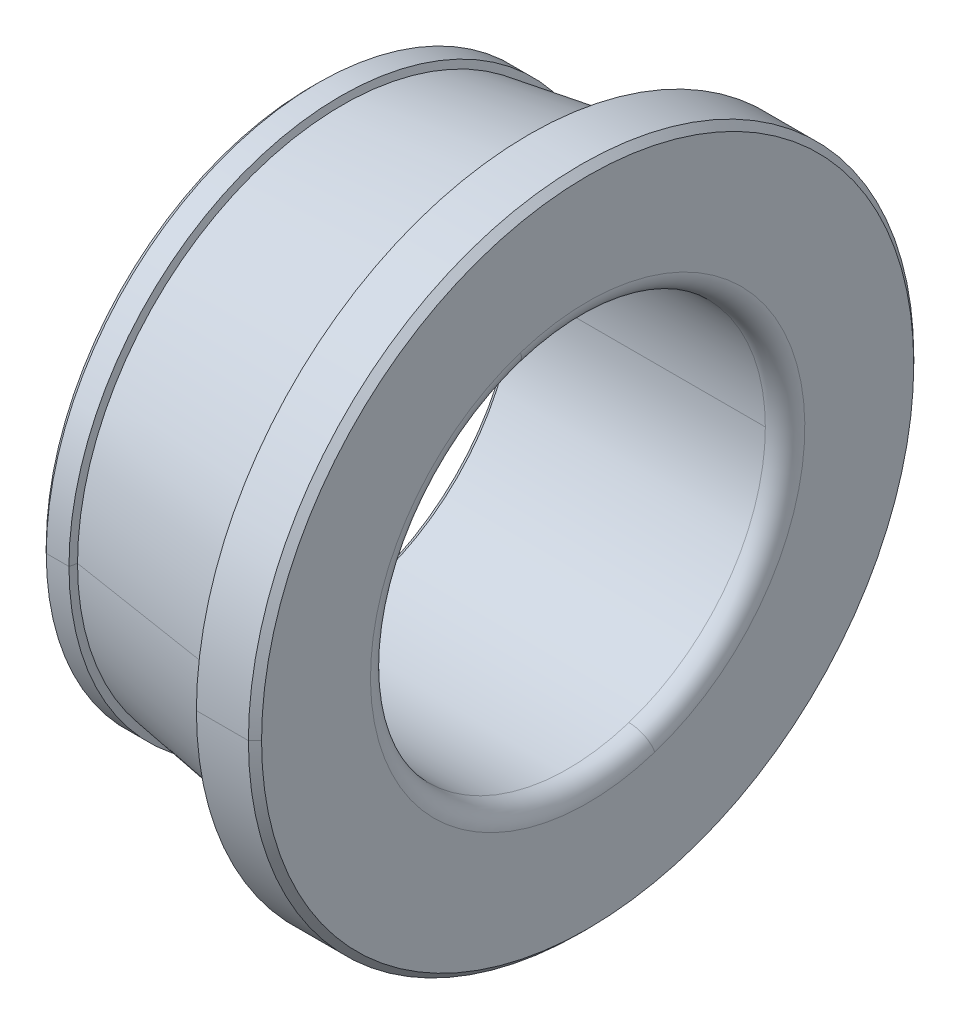
ISO-10303-21;
HEADER;
FILE_DESCRIPTION(('STEP AP214'),'2;1');
FILE_NAME('part.step','',(''),(''),'','','');
FILE_SCHEMA(('AUTOMOTIVE_DESIGN { 1 0 10303 214 1 1 1 1 }'));
ENDSEC;
DATA;
#1=APPLICATION_CONTEXT('core data for automotive mechanical design processes');
#2=APPLICATION_PROTOCOL_DEFINITION('international standard','automotive_design',2000,#1);
#3=PRODUCT_CONTEXT('',#1,'mechanical');
#4=PRODUCT('Part','Part','',(#3));
#5=PRODUCT_RELATED_PRODUCT_CATEGORY('part','',(#4));
#6=PRODUCT_DEFINITION_FORMATION('','',#4);
#7=PRODUCT_DEFINITION_CONTEXT('part definition',#1,'design');
#8=PRODUCT_DEFINITION('design','',#6,#7);
#9=PRODUCT_DEFINITION_SHAPE('','',#8);
#10=(LENGTH_UNIT() NAMED_UNIT(*) SI_UNIT(.MILLI.,.METRE.));
#11=(NAMED_UNIT(*) PLANE_ANGLE_UNIT() SI_UNIT($,.RADIAN.));
#12=(NAMED_UNIT(*) SI_UNIT($,.STERADIAN.) SOLID_ANGLE_UNIT());
#13=UNCERTAINTY_MEASURE_WITH_UNIT(LENGTH_MEASURE(1.E-05),#10,'distance_accuracy_value','');
#14=(GEOMETRIC_REPRESENTATION_CONTEXT(3) GLOBAL_UNCERTAINTY_ASSIGNED_CONTEXT((#13)) GLOBAL_UNIT_ASSIGNED_CONTEXT((#10,
#11,#12)) REPRESENTATION_CONTEXT('',''));
#15=CARTESIAN_POINT('',(0.,0.,0.));
#16=DIRECTION('',(0.,0.,1.));
#17=DIRECTION('',(1.,0.,0.));
#18=AXIS2_PLACEMENT_3D('',#15,#16,#17);
#19=CARTESIAN_POINT('',(1.25,13.422166666667,0.));
#20=DIRECTION('',(-1.,0.,0.));
#21=DIRECTION('',(0.,0.,1.));
#22=AXIS2_PLACEMENT_3D('',#19,#20,#21);
#23=PLANE('',#22);
#24=CARTESIAN_POINT('',(1.25,0.,0.));
#25=DIRECTION('',(1.,0.,0.));
#26=DIRECTION('',(0.,0.,-1.));
#27=AXIS2_PLACEMENT_3D('',#24,#25,#26);
#28=CIRCLE('',#27,10.333333333333);
#29=CARTESIAN_POINT('',(1.25,0.,-10.333333333333));
#30=VERTEX_POINT('',#29);
#31=CARTESIAN_POINT('',(1.25,0.,10.333333333333));
#32=VERTEX_POINT('',#31);
#33=EDGE_CURVE('E11',#30,#32,#28,.T.);
#34=ORIENTED_EDGE('',*,*,#33,.T.);
#35=CARTESIAN_POINT('',(1.25,0.,0.));
#36=DIRECTION('',(1.,0.,0.));
#37=DIRECTION('',(0.,0.,-1.));
#38=AXIS2_PLACEMENT_3D('',#35,#36,#37);
#39=CIRCLE('',#38,10.333333333333);
#40=EDGE_CURVE('E25',#32,#30,#39,.T.);
#41=ORIENTED_EDGE('',*,*,#40,.T.);
#42=EDGE_LOOP('',(#34,#41));
#43=FACE_BOUND('',#42,.T.);
#44=CARTESIAN_POINT('',(1.25,0.,0.));
#45=DIRECTION('',(1.,0.,0.));
#46=DIRECTION('',(0.,0.,-1.));
#47=AXIS2_PLACEMENT_3D('',#44,#45,#46);
#48=CIRCLE('',#47,13.422166666667);
#49=CARTESIAN_POINT('',(1.25,0.,13.422166666667));
#50=VERTEX_POINT('',#49);
#51=CARTESIAN_POINT('',(1.25,0.,-13.422166666667));
#52=VERTEX_POINT('',#51);
#53=EDGE_CURVE('E371',#50,#52,#48,.T.);
#54=ORIENTED_EDGE('',*,*,#53,.F.);
#55=CARTESIAN_POINT('',(1.25,0.,0.));
#56=DIRECTION('',(1.,0.,0.));
#57=DIRECTION('',(0.,0.,-1.));
#58=AXIS2_PLACEMENT_3D('',#55,#56,#57);
#59=CIRCLE('',#58,13.422166666667);
#60=EDGE_CURVE('E366',#52,#50,#59,.T.);
#61=ORIENTED_EDGE('',*,*,#60,.F.);
#62=EDGE_LOOP('',(#54,#61));
#63=FACE_BOUND('',#62,.T.);
#64=ADVANCED_FACE('F17',(#43,#63),#23,.T.);
#65=CARTESIAN_POINT('',(1.5833333333333,0.,0.));
#66=DIRECTION('',(1.,0.,0.));
#67=DIRECTION('',(0.,-1.,0.));
#68=AXIS2_PLACEMENT_3D('',#65,#66,#67);
#69=CONICAL_SURFACE('',#68,13.7555,0.785398163396998);
#70=DIRECTION('',(0.707106781186866,0.,0.707106781186229));
#71=VECTOR('',#70,1.);
#72=CARTESIAN_POINT('',(1.25,0.,13.422166666667));
#73=LINE('',#72,#71);
#74=CARTESIAN_POINT('',(1.5833333333333,0.,13.7555));
#75=VERTEX_POINT('',#74);
#76=EDGE_CURVE('E362',#50,#75,#73,.T.);
#77=ORIENTED_EDGE('',*,*,#76,.T.);
#78=CARTESIAN_POINT('',(1.5833333333333,0.,0.));
#79=DIRECTION('',(1.,0.,0.));
#80=DIRECTION('',(0.,0.,-1.));
#81=AXIS2_PLACEMENT_3D('',#78,#79,#80);
#82=CIRCLE('',#81,13.7555);
#83=CARTESIAN_POINT('',(1.5833333333333,0.,-13.7555));
#84=VERTEX_POINT('',#83);
#85=EDGE_CURVE('E357',#84,#75,#82,.T.);
#86=ORIENTED_EDGE('',*,*,#85,.F.);
#87=DIRECTION('',(0.707106781186866,0.,-0.707106781186229));
#88=VECTOR('',#87,1.);
#89=CARTESIAN_POINT('',(1.25,0.,-13.422166666667));
#90=LINE('',#89,#88);
#91=EDGE_CURVE('E352',#52,#84,#90,.T.);
#92=ORIENTED_EDGE('',*,*,#91,.F.);
#93=ORIENTED_EDGE('',*,*,#60,.T.);
#94=EDGE_LOOP('',(#77,#86,#92,#93));
#95=FACE_BOUND('',#94,.T.);
#96=ADVANCED_FACE('F387',(#95),#69,.T.);
#97=CARTESIAN_POINT('',(1.5833333333333,0.,0.));
#98=DIRECTION('',(1.,0.,0.));
#99=DIRECTION('',(0.,1.,0.));
#100=AXIS2_PLACEMENT_3D('',#97,#98,#99);
#101=CONICAL_SURFACE('',#100,13.7555,0.785398163396998);
#102=ORIENTED_EDGE('',*,*,#76,.F.);
#103=ORIENTED_EDGE('',*,*,#53,.T.);
#104=ORIENTED_EDGE('',*,*,#91,.T.);
#105=CARTESIAN_POINT('',(1.5833333333333,0.,0.));
#106=DIRECTION('',(1.,0.,0.));
#107=DIRECTION('',(0.,0.,-1.));
#108=AXIS2_PLACEMENT_3D('',#105,#106,#107);
#109=CIRCLE('',#108,13.7555);
#110=EDGE_CURVE('E347',#75,#84,#109,.T.);
#111=ORIENTED_EDGE('',*,*,#110,.F.);
#112=EDGE_LOOP('',(#102,#103,#104,#111));
#113=FACE_BOUND('',#112,.T.);
#114=ADVANCED_FACE('F382',(#113),#101,.T.);
#115=CARTESIAN_POINT('',(15.25,0.,0.));
#116=DIRECTION('',(1.,0.,0.));
#117=DIRECTION('',(0.,1.,0.));
#118=AXIS2_PLACEMENT_3D('',#115,#116,#117);
#119=CYLINDRICAL_SURFACE('',#118,13.7555);
#120=DIRECTION('',(1.,0.,0.));
#121=VECTOR('',#120,1.);
#122=CARTESIAN_POINT('',(1.5833333333333,0.,13.7555));
#123=LINE('',#122,#121);
#124=CARTESIAN_POINT('',(2.7336148439793,0.,13.7555));
#125=VERTEX_POINT('',#124);
#126=EDGE_CURVE('E342',#75,#125,#123,.T.);
#127=ORIENTED_EDGE('',*,*,#126,.F.);
#128=ORIENTED_EDGE('',*,*,#110,.T.);
#129=DIRECTION('',(1.,0.,0.));
#130=VECTOR('',#129,1.);
#131=CARTESIAN_POINT('',(1.5833333333333,0.,-13.7555));
#132=LINE('',#131,#130);
#133=CARTESIAN_POINT('',(2.7336148439793,0.,-13.7555));
#134=VERTEX_POINT('',#133);
#135=EDGE_CURVE('E338',#84,#134,#132,.T.);
#136=ORIENTED_EDGE('',*,*,#135,.T.);
#137=CARTESIAN_POINT('',(2.7336148439793,0.,0.));
#138=DIRECTION('',(1.,0.,0.));
#139=DIRECTION('',(0.,0.,-1.));
#140=AXIS2_PLACEMENT_3D('',#137,#138,#139);
#141=CIRCLE('',#140,13.7555);
#142=EDGE_CURVE('E333',#125,#134,#141,.T.);
#143=ORIENTED_EDGE('',*,*,#142,.F.);
#144=EDGE_LOOP('',(#127,#128,#136,#143));
#145=FACE_BOUND('',#144,.T.);
#146=ADVANCED_FACE('F394',(#145),#119,.T.);
#147=CARTESIAN_POINT('',(2.8147202541345,0.,0.));
#148=DIRECTION('',(-1.,0.,0.));
#149=DIRECTION('',(0.,1.,0.));
#150=AXIS2_PLACEMENT_3D('',#147,#148,#149);
#151=CONICAL_SURFACE('',#150,13.402874416571,1.34472382878367);
#152=DIRECTION('',(-0.224151698358248,0.,-0.974554265355764));
#153=VECTOR('',#152,1.);
#154=CARTESIAN_POINT('',(2.8147202541345,0.,-13.402874416571));
#155=LINE('',#154,#153);
#156=CARTESIAN_POINT('',(2.8147202541345,0.,-13.402874416571));
#157=VERTEX_POINT('',#156);
#158=EDGE_CURVE('E328',#157,#134,#155,.T.);
#159=ORIENTED_EDGE('',*,*,#158,.F.);
#160=CARTESIAN_POINT('',(2.8147202541345,0.,0.));
#161=DIRECTION('',(1.,0.,0.));
#162=DIRECTION('',(0.,0.,-1.));
#163=AXIS2_PLACEMENT_3D('',#160,#161,#162);
#164=CIRCLE('',#163,13.402874416571);
#165=CARTESIAN_POINT('',(2.8147202541345,0.,13.402874416571));
#166=VERTEX_POINT('',#165);
#167=EDGE_CURVE('E323',#166,#157,#164,.T.);
#168=ORIENTED_EDGE('',*,*,#167,.F.);
#169=DIRECTION('',(-0.224151698358248,0.,0.974554265355764));
#170=VECTOR('',#169,1.);
#171=CARTESIAN_POINT('',(2.8147202541345,0.,13.402874416571));
#172=LINE('',#171,#170);
#173=EDGE_CURVE('E318',#166,#125,#172,.T.);
#174=ORIENTED_EDGE('',*,*,#173,.T.);
#175=ORIENTED_EDGE('',*,*,#142,.T.);
#176=EDGE_LOOP('',(#159,#168,#174,#175));
#177=FACE_BOUND('',#176,.T.);
#178=ADVANCED_FACE('F396',(#177),#151,.T.);
#179=CARTESIAN_POINT('',(2.8147202541345,0.,0.));
#180=DIRECTION('',(-1.,0.,0.));
#181=DIRECTION('',(0.,-1.,0.));
#182=AXIS2_PLACEMENT_3D('',#179,#180,#181);
#183=CONICAL_SURFACE('',#182,13.402874416571,1.34472382878367);
#184=ORIENTED_EDGE('',*,*,#158,.T.);
#185=CARTESIAN_POINT('',(2.7336148439793,0.,0.));
#186=DIRECTION('',(1.,0.,0.));
#187=DIRECTION('',(0.,0.,-1.));
#188=AXIS2_PLACEMENT_3D('',#185,#186,#187);
#189=CIRCLE('',#188,13.7555);
#190=EDGE_CURVE('E313',#134,#125,#189,.T.);
#191=ORIENTED_EDGE('',*,*,#190,.T.);
#192=ORIENTED_EDGE('',*,*,#173,.F.);
#193=CARTESIAN_POINT('',(2.8147202541345,0.,0.));
#194=DIRECTION('',(1.,0.,0.));
#195=DIRECTION('',(0.,0.,-1.));
#196=AXIS2_PLACEMENT_3D('',#193,#194,#195);
#197=CIRCLE('',#196,13.402874416571);
#198=EDGE_CURVE('E308',#157,#166,#197,.T.);
#199=ORIENTED_EDGE('',*,*,#198,.F.);
#200=EDGE_LOOP('',(#184,#191,#192,#199));
#201=FACE_BOUND('',#200,.T.);
#202=ADVANCED_FACE('F401',(#201),#183,.T.);
#203=CARTESIAN_POINT('',(12.717476808964,0.,0.));
#204=DIRECTION('',(1.,0.,0.));
#205=DIRECTION('',(0.,-1.,0.));
#206=AXIS2_PLACEMENT_3D('',#203,#204,#205);
#207=CONICAL_SURFACE('',#206,14.960865559481,0.15604988842076);
#208=DIRECTION('',(0.987848904399816,0.,0.155417315882381));
#209=VECTOR('',#208,1.);
#210=CARTESIAN_POINT('',(2.81472025413452,0.,13.402874416571));
#211=LINE('',#210,#209);
#212=CARTESIAN_POINT('',(12.717476808964,0.,14.960865559481));
#213=VERTEX_POINT('',#212);
#214=EDGE_CURVE('E304',#166,#213,#211,.T.);
#215=ORIENTED_EDGE('',*,*,#214,.T.);
#216=CARTESIAN_POINT('',(12.717476808964,0.,0.));
#217=DIRECTION('',(1.,0.,0.));
#218=DIRECTION('',(0.,0.,-1.));
#219=AXIS2_PLACEMENT_3D('',#216,#217,#218);
#220=CIRCLE('',#219,14.960865559481);
#221=CARTESIAN_POINT('',(12.717476808964,0.,-14.960865559481));
#222=VERTEX_POINT('',#221);
#223=EDGE_CURVE('E299',#222,#213,#220,.T.);
#224=ORIENTED_EDGE('',*,*,#223,.F.);
#225=DIRECTION('',(0.987848904399816,0.,-0.155417315882381));
#226=VECTOR('',#225,1.);
#227=CARTESIAN_POINT('',(2.81472025413452,0.,-13.402874416571));
#228=LINE('',#227,#226);
#229=EDGE_CURVE('E294',#157,#222,#228,.T.);
#230=ORIENTED_EDGE('',*,*,#229,.F.);
#231=ORIENTED_EDGE('',*,*,#198,.T.);
#232=EDGE_LOOP('',(#215,#224,#230,#231));
#233=FACE_BOUND('',#232,.T.);
#234=ADVANCED_FACE('F408',(#233),#207,.T.);
#235=CARTESIAN_POINT('',(12.717476808964,0.,0.));
#236=DIRECTION('',(1.,0.,0.));
#237=DIRECTION('',(0.,1.,0.));
#238=AXIS2_PLACEMENT_3D('',#235,#236,#237);
#239=CONICAL_SURFACE('',#238,14.960865559481,0.15604988842076);
#240=ORIENTED_EDGE('',*,*,#214,.F.);
#241=ORIENTED_EDGE('',*,*,#167,.T.);
#242=ORIENTED_EDGE('',*,*,#229,.T.);
#243=CARTESIAN_POINT('',(12.717476808964,0.,0.));
#244=DIRECTION('',(1.,0.,0.));
#245=DIRECTION('',(0.,0.,-1.));
#246=AXIS2_PLACEMENT_3D('',#243,#244,#245);
#247=CIRCLE('',#246,14.960865559481);
#248=EDGE_CURVE('E289',#213,#222,#247,.T.);
#249=ORIENTED_EDGE('',*,*,#248,.F.);
#250=EDGE_LOOP('',(#240,#241,#242,#249));
#251=FACE_BOUND('',#250,.T.);
#252=ADVANCED_FACE('F405',(#251),#239,.T.);
#253=CARTESIAN_POINT('',(12.282967712527,0.,0.));
#254=DIRECTION('',(-1.,0.,0.));
#255=DIRECTION('',(0.,1.,0.));
#256=AXIS2_PLACEMENT_3D('',#253,#254,#255);
#257=CONICAL_SURFACE('',#256,16.85,1.34472382878411);
#258=DIRECTION('',(-0.224151698357829,0.,-0.97455426535586));
#259=VECTOR('',#258,1.);
#260=CARTESIAN_POINT('',(12.717476808964,0.,-14.960865559481));
#261=LINE('',#260,#259);
#262=CARTESIAN_POINT('',(12.282967712527,0.,-16.85));
#263=VERTEX_POINT('',#262);
#264=EDGE_CURVE('E285',#222,#263,#261,.T.);
#265=ORIENTED_EDGE('',*,*,#264,.T.);
#266=CARTESIAN_POINT('',(12.282967712527,0.,0.));
#267=DIRECTION('',(1.,0.,0.));
#268=DIRECTION('',(0.,0.,-1.));
#269=AXIS2_PLACEMENT_3D('',#266,#267,#268);
#270=CIRCLE('',#269,16.85);
#271=CARTESIAN_POINT('',(12.282967712527,0.,16.85));
#272=VERTEX_POINT('',#271);
#273=EDGE_CURVE('E280',#272,#263,#270,.T.);
#274=ORIENTED_EDGE('',*,*,#273,.F.);
#275=DIRECTION('',(-0.224151698357829,0.,0.97455426535586));
#276=VECTOR('',#275,1.);
#277=CARTESIAN_POINT('',(12.717476808964,0.,14.960865559481));
#278=LINE('',#277,#276);
#279=EDGE_CURVE('E275',#213,#272,#278,.T.);
#280=ORIENTED_EDGE('',*,*,#279,.F.);
#281=ORIENTED_EDGE('',*,*,#248,.T.);
#282=EDGE_LOOP('',(#265,#274,#280,#281));
#283=FACE_BOUND('',#282,.T.);
#284=ADVANCED_FACE('F410',(#283),#257,.F.);
#285=CARTESIAN_POINT('',(12.282967712527,0.,0.));
#286=DIRECTION('',(-1.,0.,0.));
#287=DIRECTION('',(0.,-1.,0.));
#288=AXIS2_PLACEMENT_3D('',#285,#286,#287);
#289=CONICAL_SURFACE('',#288,16.85,1.34472382878411);
#290=ORIENTED_EDGE('',*,*,#264,.F.);
#291=ORIENTED_EDGE('',*,*,#223,.T.);
#292=ORIENTED_EDGE('',*,*,#279,.T.);
#293=CARTESIAN_POINT('',(12.282967712527,0.,0.));
#294=DIRECTION('',(1.,0.,0.));
#295=DIRECTION('',(0.,0.,-1.));
#296=AXIS2_PLACEMENT_3D('',#293,#294,#295);
#297=CIRCLE('',#296,16.85);
#298=EDGE_CURVE('E270',#263,#272,#297,.T.);
#299=ORIENTED_EDGE('',*,*,#298,.F.);
#300=EDGE_LOOP('',(#290,#291,#292,#299));
#301=FACE_BOUND('',#300,.T.);
#302=ADVANCED_FACE('F415',(#301),#289,.F.);
#303=CARTESIAN_POINT('',(15.25,0.,0.));
#304=DIRECTION('',(1.,0.,0.));
#305=DIRECTION('',(0.,-1.,0.));
#306=AXIS2_PLACEMENT_3D('',#303,#304,#305);
#307=CYLINDRICAL_SURFACE('',#306,16.85);
#308=DIRECTION('',(1.,0.,0.));
#309=VECTOR('',#308,1.);
#310=CARTESIAN_POINT('',(12.282967712527,0.,16.85));
#311=LINE('',#310,#309);
#312=CARTESIAN_POINT('',(14.916666666667,0.,16.85));
#313=VERTEX_POINT('',#312);
#314=EDGE_CURVE('E266',#272,#313,#311,.T.);
#315=ORIENTED_EDGE('',*,*,#314,.T.);
#316=CARTESIAN_POINT('',(14.916666666667,0.,0.));
#317=DIRECTION('',(1.,0.,0.));
#318=DIRECTION('',(0.,0.,-1.));
#319=AXIS2_PLACEMENT_3D('',#316,#317,#318);
#320=CIRCLE('',#319,16.85);
#321=CARTESIAN_POINT('',(14.916666666667,0.,-16.85));
#322=VERTEX_POINT('',#321);
#323=EDGE_CURVE('E261',#322,#313,#320,.T.);
#324=ORIENTED_EDGE('',*,*,#323,.F.);
#325=DIRECTION('',(1.,0.,0.));
#326=VECTOR('',#325,1.);
#327=CARTESIAN_POINT('',(12.282967712527,0.,-16.85));
#328=LINE('',#327,#326);
#329=EDGE_CURVE('E256',#263,#322,#328,.T.);
#330=ORIENTED_EDGE('',*,*,#329,.F.);
#331=ORIENTED_EDGE('',*,*,#298,.T.);
#332=EDGE_LOOP('',(#315,#324,#330,#331));
#333=FACE_BOUND('',#332,.T.);
#334=ADVANCED_FACE('F421',(#333),#307,.T.);
#335=CARTESIAN_POINT('',(15.25,0.,0.));
#336=DIRECTION('',(1.,0.,0.));
#337=DIRECTION('',(0.,1.,0.));
#338=AXIS2_PLACEMENT_3D('',#335,#336,#337);
#339=CYLINDRICAL_SURFACE('',#338,16.85);
#340=ORIENTED_EDGE('',*,*,#314,.F.);
#341=ORIENTED_EDGE('',*,*,#273,.T.);
#342=ORIENTED_EDGE('',*,*,#329,.T.);
#343=CARTESIAN_POINT('',(14.916666666667,0.,0.));
#344=DIRECTION('',(1.,0.,0.));
#345=DIRECTION('',(0.,0.,-1.));
#346=AXIS2_PLACEMENT_3D('',#343,#344,#345);
#347=CIRCLE('',#346,16.85);
#348=EDGE_CURVE('E251',#313,#322,#347,.T.);
#349=ORIENTED_EDGE('',*,*,#348,.F.);
#350=EDGE_LOOP('',(#340,#341,#342,#349));
#351=FACE_BOUND('',#350,.T.);
#352=ADVANCED_FACE('F419',(#351),#339,.T.);
#353=CARTESIAN_POINT('',(15.25,0.,0.));
#354=DIRECTION('',(-1.,0.,0.));
#355=DIRECTION('',(0.,1.,0.));
#356=AXIS2_PLACEMENT_3D('',#353,#354,#355);
#357=CONICAL_SURFACE('',#356,16.516666666667,0.78539816339745);
#358=DIRECTION('',(-0.707106781186548,0.,-0.707106781186548));
#359=VECTOR('',#358,1.);
#360=CARTESIAN_POINT('',(15.25,0.,-16.516666666667));
#361=LINE('',#360,#359);
#362=CARTESIAN_POINT('',(15.25,0.,-16.516666666667));
#363=VERTEX_POINT('',#362);
#364=EDGE_CURVE('E246',#363,#322,#361,.T.);
#365=ORIENTED_EDGE('',*,*,#364,.F.);
#366=CARTESIAN_POINT('',(15.25,0.,0.));
#367=DIRECTION('',(1.,0.,0.));
#368=DIRECTION('',(0.,0.,-1.));
#369=AXIS2_PLACEMENT_3D('',#366,#367,#368);
#370=CIRCLE('',#369,16.516666666667);
#371=CARTESIAN_POINT('',(15.25,0.,16.516666666667));
#372=VERTEX_POINT('',#371);
#373=EDGE_CURVE('E241',#372,#363,#370,.T.);
#374=ORIENTED_EDGE('',*,*,#373,.F.);
#375=DIRECTION('',(-0.707106781186548,0.,0.707106781186548));
#376=VECTOR('',#375,1.);
#377=CARTESIAN_POINT('',(15.25,0.,16.516666666667));
#378=LINE('',#377,#376);
#379=EDGE_CURVE('E236',#372,#313,#378,.T.);
#380=ORIENTED_EDGE('',*,*,#379,.T.);
#381=ORIENTED_EDGE('',*,*,#348,.T.);
#382=EDGE_LOOP('',(#365,#374,#380,#381));
#383=FACE_BOUND('',#382,.T.);
#384=ADVANCED_FACE('F427',(#383),#357,.T.);
#385=CARTESIAN_POINT('',(15.25,0.,0.));
#386=DIRECTION('',(-1.,0.,0.));
#387=DIRECTION('',(0.,-1.,0.));
#388=AXIS2_PLACEMENT_3D('',#385,#386,#387);
#389=CONICAL_SURFACE('',#388,16.516666666667,0.78539816339745);
#390=ORIENTED_EDGE('',*,*,#364,.T.);
#391=ORIENTED_EDGE('',*,*,#323,.T.);
#392=ORIENTED_EDGE('',*,*,#379,.F.);
#393=CARTESIAN_POINT('',(15.25,0.,0.));
#394=DIRECTION('',(1.,0.,0.));
#395=DIRECTION('',(0.,0.,-1.));
#396=AXIS2_PLACEMENT_3D('',#393,#394,#395);
#397=CIRCLE('',#396,16.516666666667);
#398=EDGE_CURVE('E233',#363,#372,#397,.T.);
#399=ORIENTED_EDGE('',*,*,#398,.F.);
#400=EDGE_LOOP('',(#390,#391,#392,#399));
#401=FACE_BOUND('',#400,.T.);
#402=ADVANCED_FACE('F424',(#401),#389,.T.);
#403=CARTESIAN_POINT('',(15.25,11.,0.));
#404=DIRECTION('',(1.,0.,0.));
#405=DIRECTION('',(0.,0.,-1.));
#406=AXIS2_PLACEMENT_3D('',#403,#404,#405);
#407=PLANE('',#406);
#408=ORIENTED_EDGE('',*,*,#398,.T.);
#409=ORIENTED_EDGE('',*,*,#373,.T.);
#410=EDGE_LOOP('',(#408,#409));
#411=FACE_BOUND('',#410,.T.);
#412=CARTESIAN_POINT('',(15.25,-10.4616216792452,-3.39918693812396));
#413=CARTESIAN_POINT('',(15.25,-10.4060061879769,-3.57036617524389));
#414=CARTESIAN_POINT('',(15.25,-10.3461823267673,-3.74017768848981));
#415=CARTESIAN_POINT('',(15.25,-10.2182776734522,-4.07666213967826));
#416=CARTESIAN_POINT('',(15.25,-10.1501968813469,-4.24333507762079));
#417=CARTESIAN_POINT('',(15.25,-10.0059381752273,-4.57313925064709));
#418=CARTESIAN_POINT('',(15.25,-9.92976026121305,-4.73627048573086));
#419=CARTESIAN_POINT('',(15.25,-9.76949195689547,-5.05859868374808));
#420=CARTESIAN_POINT('',(15.25,-9.68540156659211,-5.21779564668152));
#421=CARTESIAN_POINT('',(15.25,-9.50951058900669,-5.53187166624998));
#422=CARTESIAN_POINT('',(15.25,-9.41771000172464,-5.68675072288499));
#423=CARTESIAN_POINT('',(15.25,-9.22661986670586,-5.99181784338258));
#424=CARTESIAN_POINT('',(15.25,-9.12733031896913,-6.14200590724515));
#425=CARTESIAN_POINT('',(15.25,-8.92150143858959,-6.43732921776055));
#426=CARTESIAN_POINT('',(15.25,-8.81496210594678,-6.58246446441337));
#427=CARTESIAN_POINT('',(15.25,-8.59489032414526,-6.8673324991947));
#428=CARTESIAN_POINT('',(15.25,-8.48135787498654,-7.00706528732321));
#429=CARTESIAN_POINT('',(15.25,-8.24757336821175,-7.28079177593882));
#430=CARTESIAN_POINT('',(15.25,-8.12732131059568,-7.41478547642591));
#431=CARTESIAN_POINT('',(15.25,-7.88038728506268,-7.6767109873562));
#432=CARTESIAN_POINT('',(15.25,-7.75370531714575,-7.8046427977994));
#433=CARTESIAN_POINT('',(15.25,-7.49421665885607,-8.05413632966257));
#434=CARTESIAN_POINT('',(15.25,-7.36140996848332,-8.17569805108256));
#435=CARTESIAN_POINT('',(15.25,-7.08999180826153,-8.41215855207623));
#436=CARTESIAN_POINT('',(15.25,-6.95138033841249,-8.52705733164992));
#437=CARTESIAN_POINT('',(15.25,-6.66868654640191,-8.74991514772403));
#438=CARTESIAN_POINT('',(15.25,-6.52460422424036,-8.85787418422444));
#439=CARTESIAN_POINT('',(15.25,-6.23131583454112,-9.06659243137779));
#440=CARTESIAN_POINT('',(15.25,-6.08210976700342,-9.16735164203072));
#441=CARTESIAN_POINT('',(15.25,-5.7789333370369,-9.36142749972496));
#442=CARTESIAN_POINT('',(15.25,-5.62496297460807,-9.45474414676626));
#443=CARTESIAN_POINT('',(15.25,-5.31262888294876,-9.633710069261));
#444=CARTESIAN_POINT('',(15.25,-5.15426515371827,-9.71935934471444));
#445=CARTESIAN_POINT('',(15.25,-4.83352584055033,-9.88278418742687));
#446=CARTESIAN_POINT('',(15.25,-4.67115025661287,-9.96055975468587));
#447=CARTESIAN_POINT('',(15.25,-4.34277841103513,-10.1080498128556));
#448=CARTESIAN_POINT('',(15.25,-4.17678214939485,-10.1777643037663));
#449=CARTESIAN_POINT('',(15.25,-3.8415688479453,-10.3089642609245));
#450=CARTESIAN_POINT('',(15.25,-3.67235180813603,-10.370449727172));
#451=CARTESIAN_POINT('',(15.25,-3.33110460901907,-10.4850435111302));
#452=CARTESIAN_POINT('',(15.25,-3.15907444971138,-10.5381518288409));
#453=CARTESIAN_POINT('',(15.25,-2.81261544731941,-10.6358633731363));
#454=CARTESIAN_POINT('',(15.25,-2.63818660423513,-10.680466599721));
#455=CARTESIAN_POINT('',(15.25,-2.28735044865114,-10.7610605086849));
#456=CARTESIAN_POINT('',(15.25,-2.11094313615143,-10.797051191064));
#457=CARTESIAN_POINT('',(15.25,-1.75657502240383,-10.8603333069105));
#458=CARTESIAN_POINT('',(15.25,-1.57861422115595,-10.8876247403778));
#459=CARTESIAN_POINT('',(15.25,-1.22156785306975,-10.9334426109469));
#460=CARTESIAN_POINT('',(15.25,-1.04248228623143,-10.9519690480487));
#461=CARTESIAN_POINT('',(15.25,-0.683617819780917,-10.980212294077));
#462=CARTESIAN_POINT('',(15.25,-0.503838920168718,-10.9899291030036));
#463=CARTESIAN_POINT('',(15.25,-0.144020891286382,-11.0005296840377));
#464=CARTESIAN_POINT('',(15.25,0.0360182379837549,-11.0014134561453));
#465=CARTESIAN_POINT('',(15.25,0.395922996149997,-10.994345834457));
#466=CARTESIAN_POINT('',(15.25,0.575788625046102,-10.9863944406611));
#467=CARTESIAN_POINT('',(15.25,0.934913070409896,-10.9616756427701));
#468=CARTESIAN_POINT('',(15.25,1.11417188687758,-10.9449082386749));
#469=CARTESIAN_POINT('',(15.25,1.47165085719446,-10.9025978143304));
#470=CARTESIAN_POINT('',(15.25,1.64987101104365,-10.877054794081));
#471=CARTESIAN_POINT('',(15.25,2.00484330816265,-10.8172546728011));
#472=CARTESIAN_POINT('',(15.25,2.18159545143248,-10.7829975717706));
#473=CARTESIAN_POINT('',(15.25,2.53320591599795,-10.7058518172855));
#474=CARTESIAN_POINT('',(15.25,2.70806423729361,-10.6629631638309));
#475=CARTESIAN_POINT('',(15.25,3.05546580889898,-10.5686576270202));
#476=CARTESIAN_POINT('',(15.25,3.22800905920869,-10.5172407436641));
#477=CARTESIAN_POINT('',(15.25,3.57036481703917,-10.4060026148263));
#478=CARTESIAN_POINT('',(15.25,3.74017732455993,-10.3461813693444));
#479=CARTESIAN_POINT('',(15.25,4.07666250360809,-10.2182786308751));
#480=CARTESIAN_POINT('',(15.25,4.24333517513547,-10.1501971378875));
#481=CARTESIAN_POINT('',(15.25,4.57313915313235,-10.0059379186866));
#482=CARTESIAN_POINT('',(15.25,4.73627045960185,-9.9297601924732));
#483=CARTESIAN_POINT('',(15.25,5.05859870987704,-9.76949202563535));
#484=CARTESIAN_POINT('',(15.25,5.21779565368274,-9.68540158501091));
#485=CARTESIAN_POINT('',(15.25,5.53187165924871,-9.50951057058791));
#486=CARTESIAN_POINT('',(15.25,5.68675072100899,-9.41770999678935));
#487=CARTESIAN_POINT('',(15.25,5.99181784525853,-9.22661987164117));
#488=CARTESIAN_POINT('',(15.25,6.1420059077478,-9.12733032029156));
#489=CARTESIAN_POINT('',(15.25,6.43732921725786,-8.9215014372672));
#490=CARTESIAN_POINT('',(15.25,6.58246446427866,-8.81496210559246));
#491=CARTESIAN_POINT('',(15.25,6.86733249932937,-8.59489032449961));
#492=CARTESIAN_POINT('',(15.25,7.00706528735928,-8.4813578750815));
#493=CARTESIAN_POINT('',(15.25,7.28079177590271,-8.24757336811683));
#494=CARTESIAN_POINT('',(15.25,7.41478547641622,-8.12732131057026));
#495=CARTESIAN_POINT('',(15.25,7.67671098736585,-7.88038728508814));
#496=CARTESIAN_POINT('',(15.25,7.80464279780197,-7.75370531715259));
#497=CARTESIAN_POINT('',(15.25,8.05413632965996,-7.49421665884927));
#498=CARTESIAN_POINT('',(15.25,8.17569805108184,-7.36140996848151));
#499=CARTESIAN_POINT('',(15.25,8.4121585520769,-7.08999180826338));
#500=CARTESIAN_POINT('',(15.25,8.52705733165009,-6.95138033841301));
#501=CARTESIAN_POINT('',(15.25,8.74991514772382,-6.66868654640145));
#502=CARTESIAN_POINT('',(15.25,8.85787418422437,-6.52460422424026));
#503=CARTESIAN_POINT('',(15.25,9.06659243137782,-6.23131583454128));
#504=CARTESIAN_POINT('',(15.25,9.16735164203072,-6.08210976700348));
#505=CARTESIAN_POINT('',(15.25,9.36142749972493,-5.77893333703689));
#506=CARTESIAN_POINT('',(15.25,9.45474414676624,-5.6249629746081));
#507=CARTESIAN_POINT('',(15.25,9.63371006926099,-5.3126288829488));
#508=CARTESIAN_POINT('',(15.25,9.71935934471443,-5.15426515371831));
#509=CARTESIAN_POINT('',(15.25,9.88278418742686,-4.83352584055036));
#510=CARTESIAN_POINT('',(15.25,9.96055975468585,-4.6711502566129));
#511=CARTESIAN_POINT('',(15.25,10.1080498128556,-4.34277841103516));
#512=CARTESIAN_POINT('',(15.25,10.1777643037663,-4.17678214939487));
#513=CARTESIAN_POINT('',(15.25,10.3089642609245,-3.84156884794534));
#514=CARTESIAN_POINT('',(15.25,10.3704497271719,-3.67235180813609));
#515=CARTESIAN_POINT('',(15.25,10.4850435111304,-3.33110460901906));
#516=CARTESIAN_POINT('',(15.25,10.5381518288414,-3.15907444971127));
#517=CARTESIAN_POINT('',(15.25,10.6358633731358,-2.81261544731958));
#518=CARTESIAN_POINT('',(15.25,10.6804665997191,-2.63818660423567));
#519=CARTESIAN_POINT('',(15.25,10.7610605086868,-2.28735044865066));
#520=CARTESIAN_POINT('',(15.25,10.7970511910711,-2.11094313614955));
#521=CARTESIAN_POINT('',(15.25,10.8603333069035,-1.75657502240577));
#522=CARTESIAN_POINT('',(15.25,10.8876247403515,-1.57861422116311));
#523=CARTESIAN_POINT('',(15.25,10.9334426109731,-1.22156785306265));
#524=CARTESIAN_POINT('',(15.25,10.9519690481467,-1.04248228620486));
#525=CARTESIAN_POINT('',(15.25,10.980212293979,-0.683617819807562));
#526=CARTESIAN_POINT('',(15.25,10.9899291026378,-0.503838920268065));
#527=CARTESIAN_POINT('',(15.25,11.0005296844036,-0.144020891187111));
#528=CARTESIAN_POINT('',(15.25,11.0014134575106,0.0360182383543453));
#529=CARTESIAN_POINT('',(15.25,10.9943458330917,0.395922995779333));
#530=CARTESIAN_POINT('',(15.25,10.9863944355657,0.575788623662865));
#531=CARTESIAN_POINT('',(15.25,10.9616756478655,0.934913071793061));
#532=CARTESIAN_POINT('',(15.25,10.9449082576913,1.11417189203972));
#533=CARTESIAN_POINT('',(15.25,10.902597795314,1.47165085203226));
#534=CARTESIAN_POINT('',(15.25,10.877054723111,1.64987099177814));
#535=CARTESIAN_POINT('',(15.25,10.8172547437711,2.00484332742811));
#536=CARTESIAN_POINT('',(15.25,10.7829978366341,2.18159552333222));
#537=CARTESIAN_POINT('',(15.25,10.705851552422,2.53320584409816));
#538=CARTESIAN_POINT('',(15.25,10.6629621753469,2.70806396896));
#539=CARTESIAN_POINT('',(15.25,10.5686586155041,3.05546607723253));
#540=CARTESIAN_POINT('',(15.25,10.5172444327364,3.22801006064322));
#541=CARTESIAN_POINT('',(15.25,10.4616216792452,3.3991869381239));
#542=B_SPLINE_CURVE_WITH_KNOTS('',3,(#412,#413,#414,#415,#416,#417,#418,#419,#420,#421,#422,
#423,#424,#425,#426,#427,#428,#429,#430,#431,#432,#433,#434,#435,#436,#437,#438,#439,#440,#441,
#442,#443,#444,#445,#446,#447,#448,#449,#450,#451,#452,#453,#454,#455,#456,#457,#458,#459,#460,
#461,#462,#463,#464,#465,#466,#467,#468,#469,#470,#471,#472,#473,#474,#475,#476,#477,#478,#479,
#480,#481,#482,#483,#484,#485,#486,#487,#488,#489,#490,#491,#492,#493,#494,#495,#496,#497,#498,
#499,#500,#501,#502,#503,#504,#505,#506,#507,#508,#509,#510,#511,#512,#513,#514,#515,#516,#517,
#518,#519,#520,#521,#522,#523,#524,#525,#526,#527,#528,#529,#530,#531,#532,#533,#534,#535,#536,
#537,#538,#539,#540,#541),.UNSPECIFIED.,.F.,.F.,(4,2,2,2,2,2,2,2,2,2,2,2,2,2,2,2,2,2,2,2,2,2,2,
2,2,2,2,2,2,2,2,2,2,2,2,2,2,2,2,2,2,2,2,2,2,2,2,2,2,2,2,2,2,2,2,2,2,2,2,2,2,2,2,2,4),(0.,
0.539907027503991,1.07981405500799,1.61972108251198,2.15962811001597,2.69953513751996,
3.23944216502395,3.77934919252795,4.31925622003194,4.85916324753593,5.39907027503993,
5.93897730254392,6.47888433004792,7.01879135755191,7.5586983850559,8.09860541255989,
8.63851244006389,9.17841946756788,9.71832649507187,10.2582335225759,10.7981405500799,
11.3380475775838,11.8779546050878,12.4178616325918,12.9577686600958,13.4976756875998,
14.0375827151038,14.5774897426078,15.1173967701118,15.6573037976158,16.1972108251198,
16.7371178526238,17.2770248801278,17.8169319076318,18.3568389351358,18.8967459626397,
19.4366529901437,19.9765600176477,20.5164670451517,21.0563740726557,21.5962811001597,
22.1361881276637,22.6760951551677,23.2160021826717,23.7559092101757,24.2958162376797,
24.8357232651837,25.3756302926877,25.9155373201916,26.4554443476956,26.9953513751996,
27.5352584027036,28.0751654302076,28.6150724577116,29.1549794852156,29.6948865127196,
30.2347935402236,30.7747005677276,31.3146075952316,31.8545146227356,32.3944216502396,
32.9343286777436,33.4742357052475,34.0141427327515,34.5540497602555),.UNSPECIFIED.);
#543=CARTESIAN_POINT('',(15.25,-10.4616216792452,-3.39918693812394));
#544=VERTEX_POINT('',#543);
#545=CARTESIAN_POINT('',(15.25,10.4616216792452,3.39918693812394));
#546=VERTEX_POINT('',#545);
#547=EDGE_CURVE('E232',#544,#546,#542,.T.);
#548=ORIENTED_EDGE('',*,*,#547,.F.);
#549=CARTESIAN_POINT('',(15.25,10.4616216792452,3.39918693812396));
#550=CARTESIAN_POINT('',(15.25,10.4060061879769,3.5703661752439));
#551=CARTESIAN_POINT('',(15.25,10.3461823267673,3.74017768848982));
#552=CARTESIAN_POINT('',(15.25,10.2182776734522,4.07666213967826));
#553=CARTESIAN_POINT('',(15.25,10.1501968813469,4.24333507762079));
#554=CARTESIAN_POINT('',(15.25,10.0059381752273,4.57313925064709));
#555=CARTESIAN_POINT('',(15.25,9.92976026121305,4.73627048573086));
#556=CARTESIAN_POINT('',(15.25,9.76949195689547,5.05859868374808));
#557=CARTESIAN_POINT('',(15.25,9.68540156659211,5.21779564668153));
#558=CARTESIAN_POINT('',(15.25,9.50951058900669,5.53187166624999));
#559=CARTESIAN_POINT('',(15.25,9.41771000172464,5.686750722885));
#560=CARTESIAN_POINT('',(15.25,9.22661986670586,5.99181784338258));
#561=CARTESIAN_POINT('',(15.25,9.12733031896913,6.14200590724516));
#562=CARTESIAN_POINT('',(15.25,8.92150143858959,6.43732921776055));
#563=CARTESIAN_POINT('',(15.25,8.81496210594678,6.58246446441337));
#564=CARTESIAN_POINT('',(15.25,8.59489032414525,6.86733249919471));
#565=CARTESIAN_POINT('',(15.25,8.48135787498654,7.00706528732322));
#566=CARTESIAN_POINT('',(15.25,8.24757336821175,7.28079177593882));
#567=CARTESIAN_POINT('',(15.25,8.12732131059568,7.41478547642591));
#568=CARTESIAN_POINT('',(15.25,7.88038728506267,7.67671098735621));
#569=CARTESIAN_POINT('',(15.25,7.75370531714574,7.8046427977994));
#570=CARTESIAN_POINT('',(15.25,7.49421665885606,8.05413632966258));
#571=CARTESIAN_POINT('',(15.25,7.36140996848331,8.17569805108256));
#572=CARTESIAN_POINT('',(15.25,7.08999180826152,8.41215855207623));
#573=CARTESIAN_POINT('',(15.25,6.95138033841249,8.52705733164992));
#574=CARTESIAN_POINT('',(15.25,6.6686865464019,8.74991514772403));
#575=CARTESIAN_POINT('',(15.25,6.52460422424036,8.85787418422445));
#576=CARTESIAN_POINT('',(15.25,6.23131583454111,9.06659243137779));
#577=CARTESIAN_POINT('',(15.25,6.08210976700341,9.16735164203073));
#578=CARTESIAN_POINT('',(15.25,5.77893333703689,9.36142749972496));
#579=CARTESIAN_POINT('',(15.25,5.62496297460807,9.45474414676626));
#580=CARTESIAN_POINT('',(15.25,5.31262888294876,9.633710069261));
#581=CARTESIAN_POINT('',(15.25,5.15426515371827,9.71935934471444));
#582=CARTESIAN_POINT('',(15.25,4.83352584055032,9.88278418742688));
#583=CARTESIAN_POINT('',(15.25,4.67115025661287,9.96055975468587));
#584=CARTESIAN_POINT('',(15.25,4.34277841103513,10.1080498128556));
#585=CARTESIAN_POINT('',(15.25,4.17678214939484,10.1777643037663));
#586=CARTESIAN_POINT('',(15.25,3.84156884794529,10.3089642609245));
#587=CARTESIAN_POINT('',(15.25,3.67235180813602,10.370449727172));
#588=CARTESIAN_POINT('',(15.25,3.33110460901906,10.4850435111302));
#589=CARTESIAN_POINT('',(15.25,3.15907444971137,10.5381518288409));
#590=CARTESIAN_POINT('',(15.25,2.8126154473194,10.6358633731363));
#591=CARTESIAN_POINT('',(15.25,2.63818660423512,10.680466599721));
#592=CARTESIAN_POINT('',(15.25,2.28735044865113,10.7610605086849));
#593=CARTESIAN_POINT('',(15.25,2.11094313615141,10.7970511910641));
#594=CARTESIAN_POINT('',(15.25,1.75657502240381,10.8603333069105));
#595=CARTESIAN_POINT('',(15.25,1.57861422115593,10.8876247403778));
#596=CARTESIAN_POINT('',(15.25,1.22156785306973,10.9334426109469));
#597=CARTESIAN_POINT('',(15.25,1.04248228623142,10.9519690480487));
#598=CARTESIAN_POINT('',(15.25,0.683617819780902,10.980212294077));
#599=CARTESIAN_POINT('',(15.25,0.503838920168705,10.9899291030036));
#600=CARTESIAN_POINT('',(15.25,0.14402089128637,11.0005296840377));
#601=CARTESIAN_POINT('',(15.25,-0.0360182379837685,11.0014134561453));
#602=CARTESIAN_POINT('',(15.25,-0.395922996150011,10.994345834457));
#603=CARTESIAN_POINT('',(15.25,-0.575788625046115,10.9863944406611));
#604=CARTESIAN_POINT('',(15.25,-0.934913070409908,10.9616756427701));
#605=CARTESIAN_POINT('',(15.25,-1.1141718868776,10.9449082386749));
#606=CARTESIAN_POINT('',(15.25,-1.47165085719447,10.9025978143304));
#607=CARTESIAN_POINT('',(15.25,-1.64987101104366,10.877054794081));
#608=CARTESIAN_POINT('',(15.25,-2.00484330816267,10.8172546728011));
#609=CARTESIAN_POINT('',(15.25,-2.18159545143249,10.7829975717706));
#610=CARTESIAN_POINT('',(15.25,-2.53320591599797,10.7058518172855));
#611=CARTESIAN_POINT('',(15.25,-2.70806423729363,10.6629631638309));
#612=CARTESIAN_POINT('',(15.25,-3.05546580889899,10.5686576270202));
#613=CARTESIAN_POINT('',(15.25,-3.2280090592087,10.5172407436641));
#614=CARTESIAN_POINT('',(15.25,-3.57036481703918,10.4060026148263));
#615=CARTESIAN_POINT('',(15.25,-3.74017732455995,10.3461813693444));
#616=CARTESIAN_POINT('',(15.25,-4.0766625036081,10.2182786308751));
#617=CARTESIAN_POINT('',(15.25,-4.24333517513549,10.1501971378875));
#618=CARTESIAN_POINT('',(15.25,-4.57313915313237,10.0059379186866));
#619=CARTESIAN_POINT('',(15.25,-4.73627045960186,9.92976019247319));
#620=CARTESIAN_POINT('',(15.25,-5.05859870987705,9.76949202563535));
#621=CARTESIAN_POINT('',(15.25,-5.21779565368275,9.68540158501091));
#622=CARTESIAN_POINT('',(15.25,-5.53187165924873,9.50951057058791));
#623=CARTESIAN_POINT('',(15.25,-5.686750721009,9.41770999678934));
#624=CARTESIAN_POINT('',(15.25,-5.99181784525854,9.22661987164117));
#625=CARTESIAN_POINT('',(15.25,-6.14200590774781,9.12733032029155));
#626=CARTESIAN_POINT('',(15.25,-6.43732921725788,8.92150143726719));
#627=CARTESIAN_POINT('',(15.25,-6.58246446427868,8.81496210559245));
#628=CARTESIAN_POINT('',(15.25,-6.86733249932939,8.5948903244996));
#629=CARTESIAN_POINT('',(15.25,-7.0070652873593,8.48135787508149));
#630=CARTESIAN_POINT('',(15.25,-7.28079177590272,8.24757336811682));
#631=CARTESIAN_POINT('',(15.25,-7.41478547641623,8.12732131057025));
#632=CARTESIAN_POINT('',(15.25,-7.67671098736587,7.88038728508813));
#633=CARTESIAN_POINT('',(15.25,-7.80464279780198,7.75370531715257));
#634=CARTESIAN_POINT('',(15.25,-8.05413632965998,7.49421665884926));
#635=CARTESIAN_POINT('',(15.25,-8.17569805108186,7.3614099684815));
#636=CARTESIAN_POINT('',(15.25,-8.41215855207692,7.08999180826337));
#637=CARTESIAN_POINT('',(15.25,-8.5270573316501,6.95138033841299));
#638=CARTESIAN_POINT('',(15.25,-8.74991514772383,6.66868654640143));
#639=CARTESIAN_POINT('',(15.25,-8.85787418422439,6.52460422424024));
#640=CARTESIAN_POINT('',(15.25,-9.06659243137783,6.23131583454126));
#641=CARTESIAN_POINT('',(15.25,-9.16735164203073,6.08210976700346));
#642=CARTESIAN_POINT('',(15.25,-9.36142749972494,5.77893333703687));
#643=CARTESIAN_POINT('',(15.25,-9.45474414676626,5.62496297460807));
#644=CARTESIAN_POINT('',(15.25,-9.63371006926101,5.31262888294878));
#645=CARTESIAN_POINT('',(15.25,-9.71935934471444,5.15426515371828));
#646=CARTESIAN_POINT('',(15.25,-9.88278418742687,4.83352584055033));
#647=CARTESIAN_POINT('',(15.25,-9.96055975468586,4.67115025661288));
#648=CARTESIAN_POINT('',(15.25,-10.1080498128556,4.34277841103514));
#649=CARTESIAN_POINT('',(15.25,-10.1777643037663,4.17678214939485));
#650=CARTESIAN_POINT('',(15.25,-10.3089642609245,3.84156884794532));
#651=CARTESIAN_POINT('',(15.25,-10.3704497271719,3.67235180813608));
#652=CARTESIAN_POINT('',(15.25,-10.4850435111304,3.33110460901904));
#653=CARTESIAN_POINT('',(15.25,-10.5381518288414,3.15907444971124));
#654=CARTESIAN_POINT('',(15.25,-10.6358633731358,2.81261544731955));
#655=CARTESIAN_POINT('',(15.25,-10.6804665997192,2.63818660423564));
#656=CARTESIAN_POINT('',(15.25,-10.7610605086868,2.28735044865063));
#657=CARTESIAN_POINT('',(15.25,-10.7970511910711,2.11094313614952));
#658=CARTESIAN_POINT('',(15.25,-10.8603333069035,1.75657502240574));
#659=CARTESIAN_POINT('',(15.25,-10.8876247403515,1.57861422116308));
#660=CARTESIAN_POINT('',(15.25,-10.9334426109731,1.22156785306262));
#661=CARTESIAN_POINT('',(15.25,-10.9519690481467,1.04248228620483));
#662=CARTESIAN_POINT('',(15.25,-10.980212293979,0.683617819807532));
#663=CARTESIAN_POINT('',(15.25,-10.9899291026378,0.503838920268035));
#664=CARTESIAN_POINT('',(15.25,-11.0005296844036,0.144020891187081));
#665=CARTESIAN_POINT('',(15.25,-11.0014134575106,-0.0360182383543758));
#666=CARTESIAN_POINT('',(15.25,-10.9943458330917,-0.395922995779364));
#667=CARTESIAN_POINT('',(15.25,-10.9863944355657,-0.575788623662895));
#668=CARTESIAN_POINT('',(15.25,-10.9616756478655,-0.934913071793091));
#669=CARTESIAN_POINT('',(15.25,-10.9449082576913,-1.11417189203976));
#670=CARTESIAN_POINT('',(15.25,-10.902597795314,-1.47165085203229));
#671=CARTESIAN_POINT('',(15.25,-10.877054723111,-1.64987099177817));
#672=CARTESIAN_POINT('',(15.25,-10.8172547437711,-2.00484332742814));
#673=CARTESIAN_POINT('',(15.25,-10.7829978366341,-2.18159552333224));
#674=CARTESIAN_POINT('',(15.25,-10.705851552422,-2.53320584409819));
#675=CARTESIAN_POINT('',(15.25,-10.6629621753469,-2.70806396896003));
#676=CARTESIAN_POINT('',(15.25,-10.5686586155041,-3.05546607723256));
#677=CARTESIAN_POINT('',(15.25,-10.5172444327364,-3.22801006064325));
#678=CARTESIAN_POINT('',(15.25,-10.4616216792452,-3.39918693812393));
#679=B_SPLINE_CURVE_WITH_KNOTS('',3,(#549,#550,#551,#552,#553,#554,#555,#556,#557,#558,#559,
#560,#561,#562,#563,#564,#565,#566,#567,#568,#569,#570,#571,#572,#573,#574,#575,#576,#577,#578,
#579,#580,#581,#582,#583,#584,#585,#586,#587,#588,#589,#590,#591,#592,#593,#594,#595,#596,#597,
#598,#599,#600,#601,#602,#603,#604,#605,#606,#607,#608,#609,#610,#611,#612,#613,#614,#615,#616,
#617,#618,#619,#620,#621,#622,#623,#624,#625,#626,#627,#628,#629,#630,#631,#632,#633,#634,#635,
#636,#637,#638,#639,#640,#641,#642,#643,#644,#645,#646,#647,#648,#649,#650,#651,#652,#653,#654,
#655,#656,#657,#658,#659,#660,#661,#662,#663,#664,#665,#666,#667,#668,#669,#670,#671,#672,#673,
#674,#675,#676,#677,#678),.UNSPECIFIED.,.F.,.F.,(4,2,2,2,2,2,2,2,2,2,2,2,2,2,2,2,2,2,2,2,2,2,2,
2,2,2,2,2,2,2,2,2,2,2,2,2,2,2,2,2,2,2,2,2,2,2,2,2,2,2,2,2,2,2,2,2,2,2,2,2,2,2,2,2,4),(0.,
0.539907027503992,1.07981405500799,1.61972108251198,2.15962811001597,2.69953513751996,
3.23944216502396,3.77934919252795,4.31925622003195,4.85916324753594,5.39907027503993,
5.93897730254393,6.47888433004792,7.01879135755191,7.55869838505591,8.0986054125599,
8.63851244006389,9.17841946756788,9.71832649507188,10.2582335225759,10.7981405500799,
11.3380475775839,11.8779546050879,12.4178616325918,12.9577686600958,13.4976756875998,
14.0375827151038,14.5774897426078,15.1173967701118,15.6573037976158,16.1972108251198,
16.7371178526238,17.2770248801278,17.8169319076318,18.3568389351358,18.8967459626398,
19.4366529901437,19.9765600176477,20.5164670451517,21.0563740726557,21.5962811001597,
22.1361881276637,22.6760951551677,23.2160021826717,23.7559092101757,24.2958162376797,
24.8357232651837,25.3756302926877,25.9155373201917,26.4554443476957,26.9953513751997,
27.5352584027036,28.0751654302077,28.6150724577116,29.1549794852156,29.6948865127196,
30.2347935402236,30.7747005677276,31.3146075952316,31.8545146227356,32.3944216502396,
32.9343286777436,33.4742357052476,34.0141427327516,34.5540497602556),.UNSPECIFIED.);
#680=EDGE_CURVE('E197',#546,#544,#679,.T.);
#681=ORIENTED_EDGE('',*,*,#680,.F.);
#682=EDGE_LOOP('',(#548,#681));
#683=FACE_BOUND('',#682,.T.);
#684=ADVANCED_FACE('F182',(#411,#683),#407,.T.);
#685=CARTESIAN_POINT('',(14.2500000000015,0.,0.));
#686=DIRECTION('',(1.,0.,0.));
#687=DIRECTION('',(0.,0.309016994374947,-0.951056516295154));
#688=AXIS2_PLACEMENT_3D('',#685,#686,#687);
#689=TOROIDAL_SURFACE('',#688,10.9999999999984,0.999999999998452);
#690=CARTESIAN_POINT('',(14.2500000000015,-10.4616216792452,-3.39918693812394));
#691=DIRECTION('',(0.,0.309016994374947,-0.951056516295154));
#692=DIRECTION('',(-1.53654866608359E-12,0.951056516295154,0.309016994374947));
#693=AXIS2_PLACEMENT_3D('',#690,#691,#692);
#694=CIRCLE('',#693,0.999999999998453);
#695=CARTESIAN_POINT('',(14.25,-9.51056516295152,-3.09016994374947));
#696=VERTEX_POINT('',#695);
#697=EDGE_CURVE('E206',#696,#544,#694,.T.);
#698=ORIENTED_EDGE('',*,*,#697,.F.);
#699=CARTESIAN_POINT('',(14.25,0.,0.));
#700=DIRECTION('',(1.,0.,0.));
#701=DIRECTION('',(0.,0.,-1.));
#702=AXIS2_PLACEMENT_3D('',#699,#700,#701);
#703=CIRCLE('',#702,10.);
#704=CARTESIAN_POINT('',(14.25,0.,10.));
#705=VERTEX_POINT('',#704);
#706=EDGE_CURVE('E202',#705,#696,#703,.T.);
#707=ORIENTED_EDGE('',*,*,#706,.F.);
#708=CARTESIAN_POINT('',(14.25,0.,0.));
#709=DIRECTION('',(1.,0.,0.));
#710=DIRECTION('',(0.,0.,-1.));
#711=AXIS2_PLACEMENT_3D('',#708,#709,#710);
#712=CIRCLE('',#711,10.);
#713=CARTESIAN_POINT('',(14.25,9.51056516295152,3.09016994374947));
#714=VERTEX_POINT('',#713);
#715=EDGE_CURVE('E128',#714,#705,#712,.T.);
#716=ORIENTED_EDGE('',*,*,#715,.F.);
#717=CARTESIAN_POINT('',(14.2500000000015,10.4616216792452,3.39918693812394));
#718=DIRECTION('',(0.,-0.309016994374947,0.951056516295154));
#719=DIRECTION('',(-1.538325022923E-12,-0.951056516295154,-0.309016994374947));
#720=AXIS2_PLACEMENT_3D('',#717,#718,#719);
#721=CIRCLE('',#720,0.999999999998453);
#722=EDGE_CURVE('E157',#714,#546,#721,.T.);
#723=ORIENTED_EDGE('',*,*,#722,.T.);
#724=ORIENTED_EDGE('',*,*,#680,.T.);
#725=EDGE_LOOP('',(#698,#707,#716,#723,#724));
#726=FACE_BOUND('',#725,.T.);
#727=ADVANCED_FACE('F176',(#726),#689,.T.);
#728=CARTESIAN_POINT('',(14.2500000000015,0.,0.));
#729=DIRECTION('',(1.,0.,0.));
#730=DIRECTION('',(0.,-0.309016994374947,0.951056516295154));
#731=AXIS2_PLACEMENT_3D('',#728,#729,#730);
#732=TOROIDAL_SURFACE('',#731,10.9999999999984,0.999999999998452);
#733=ORIENTED_EDGE('',*,*,#697,.T.);
#734=ORIENTED_EDGE('',*,*,#547,.T.);
#735=ORIENTED_EDGE('',*,*,#722,.F.);
#736=CARTESIAN_POINT('',(14.25,0.,0.));
#737=DIRECTION('',(1.,0.,0.));
#738=DIRECTION('',(0.,0.,-1.));
#739=AXIS2_PLACEMENT_3D('',#736,#737,#738);
#740=CIRCLE('',#739,10.);
#741=CARTESIAN_POINT('',(14.25,0.,-10.));
#742=VERTEX_POINT('',#741);
#743=EDGE_CURVE('E153',#742,#714,#740,.T.);
#744=ORIENTED_EDGE('',*,*,#743,.F.);
#745=CARTESIAN_POINT('',(14.25,0.,0.));
#746=DIRECTION('',(1.,0.,0.));
#747=DIRECTION('',(0.,0.,-1.));
#748=AXIS2_PLACEMENT_3D('',#745,#746,#747);
#749=CIRCLE('',#748,10.);
#750=EDGE_CURVE('E129',#696,#742,#749,.T.);
#751=ORIENTED_EDGE('',*,*,#750,.F.);
#752=EDGE_LOOP('',(#733,#734,#735,#744,#751));
#753=FACE_BOUND('',#752,.T.);
#754=ADVANCED_FACE('F166',(#753),#732,.T.);
#755=CARTESIAN_POINT('',(15.25,0.,0.));
#756=DIRECTION('',(1.,0.,0.));
#757=DIRECTION('',(0.,1.,0.));
#758=AXIS2_PLACEMENT_3D('',#755,#756,#757);
#759=CYLINDRICAL_SURFACE('',#758,10.);
#760=DIRECTION('',(1.,0.,0.));
#761=VECTOR('',#760,1.);
#762=CARTESIAN_POINT('',(1.5833333333333,0.,10.));
#763=LINE('',#762,#761);
#764=CARTESIAN_POINT('',(1.5833333333333,0.,10.));
#765=VERTEX_POINT('',#764);
#766=EDGE_CURVE('E112',#765,#705,#763,.T.);
#767=ORIENTED_EDGE('',*,*,#766,.T.);
#768=ORIENTED_EDGE('',*,*,#706,.T.);
#769=ORIENTED_EDGE('',*,*,#750,.T.);
#770=DIRECTION('',(1.,0.,0.));
#771=VECTOR('',#770,1.);
#772=CARTESIAN_POINT('',(1.5833333333333,0.,-10.));
#773=LINE('',#772,#771);
#774=CARTESIAN_POINT('',(1.5833333333333,0.,-10.));
#775=VERTEX_POINT('',#774);
#776=EDGE_CURVE('E115',#775,#742,#773,.T.);
#777=ORIENTED_EDGE('',*,*,#776,.F.);
#778=CARTESIAN_POINT('',(1.5833333333333,0.,0.));
#779=DIRECTION('',(1.,0.,0.));
#780=DIRECTION('',(0.,0.,-1.));
#781=AXIS2_PLACEMENT_3D('',#778,#779,#780);
#782=CIRCLE('',#781,10.);
#783=EDGE_CURVE('E108',#765,#775,#782,.T.);
#784=ORIENTED_EDGE('',*,*,#783,.F.);
#785=EDGE_LOOP('',(#767,#768,#769,#777,#784));
#786=FACE_BOUND('',#785,.T.);
#787=ADVANCED_FACE('F110',(#786),#759,.F.);
#788=CARTESIAN_POINT('',(1.25,0.,0.));
#789=DIRECTION('',(-1.,0.,0.));
#790=DIRECTION('',(0.,1.,0.));
#791=AXIS2_PLACEMENT_3D('',#788,#789,#790);
#792=CONICAL_SURFACE('',#791,10.333333333333,0.785398163396998);
#793=DIRECTION('',(-0.707106781186866,0.,-0.707106781186229));
#794=VECTOR('',#793,1.);
#795=CARTESIAN_POINT('',(1.5833333333333,0.,-10.));
#796=LINE('',#795,#794);
#797=EDGE_CURVE('E119',#775,#30,#796,.T.);
#798=ORIENTED_EDGE('',*,*,#797,.T.);
#799=ORIENTED_EDGE('',*,*,#40,.F.);
#800=DIRECTION('',(-0.707106781186866,0.,0.707106781186229));
#801=VECTOR('',#800,1.);
#802=CARTESIAN_POINT('',(1.5833333333333,0.,10.));
#803=LINE('',#802,#801);
#804=EDGE_CURVE('E133',#765,#32,#803,.T.);
#805=ORIENTED_EDGE('',*,*,#804,.F.);
#806=ORIENTED_EDGE('',*,*,#783,.T.);
#807=EDGE_LOOP('',(#798,#799,#805,#806));
#808=FACE_BOUND('',#807,.T.);
#809=ADVANCED_FACE('F135',(#808),#792,.F.);
#810=CARTESIAN_POINT('',(1.25,0.,0.));
#811=DIRECTION('',(-1.,0.,0.));
#812=DIRECTION('',(0.,-1.,0.));
#813=AXIS2_PLACEMENT_3D('',#810,#811,#812);
#814=CONICAL_SURFACE('',#813,10.333333333333,0.785398163396998);
#815=ORIENTED_EDGE('',*,*,#797,.F.);
#816=CARTESIAN_POINT('',(1.5833333333333,0.,0.));
#817=DIRECTION('',(1.,0.,0.));
#818=DIRECTION('',(0.,0.,-1.));
#819=AXIS2_PLACEMENT_3D('',#816,#817,#818);
#820=CIRCLE('',#819,10.);
#821=EDGE_CURVE('E125',#775,#765,#820,.T.);
#822=ORIENTED_EDGE('',*,*,#821,.T.);
#823=ORIENTED_EDGE('',*,*,#804,.T.);
#824=ORIENTED_EDGE('',*,*,#33,.F.);
#825=EDGE_LOOP('',(#815,#822,#823,#824));
#826=FACE_BOUND('',#825,.T.);
#827=ADVANCED_FACE('F132',(#826),#814,.F.);
#828=CARTESIAN_POINT('',(15.25,0.,0.));
#829=DIRECTION('',(1.,0.,0.));
#830=DIRECTION('',(0.,-1.,-7.04620268042598E-12));
#831=AXIS2_PLACEMENT_3D('',#828,#829,#830);
#832=CYLINDRICAL_SURFACE('',#831,10.);
#833=ORIENTED_EDGE('',*,*,#766,.F.);
#834=ORIENTED_EDGE('',*,*,#821,.F.);
#835=ORIENTED_EDGE('',*,*,#776,.T.);
#836=ORIENTED_EDGE('',*,*,#743,.T.);
#837=ORIENTED_EDGE('',*,*,#715,.T.);
#838=EDGE_LOOP('',(#833,#834,#835,#836,#837));
#839=FACE_BOUND('',#838,.T.);
#840=ADVANCED_FACE('F124',(#839),#832,.F.);
#841=CARTESIAN_POINT('',(15.25,0.,0.));
#842=DIRECTION('',(1.,0.,0.));
#843=DIRECTION('',(0.,-1.,0.));
#844=AXIS2_PLACEMENT_3D('',#841,#842,#843);
#845=CYLINDRICAL_SURFACE('',#844,13.7555);
#846=ORIENTED_EDGE('',*,*,#126,.T.);
#847=ORIENTED_EDGE('',*,*,#190,.F.);
#848=ORIENTED_EDGE('',*,*,#135,.F.);
#849=ORIENTED_EDGE('',*,*,#85,.T.);
#850=EDGE_LOOP('',(#846,#847,#848,#849));
#851=FACE_BOUND('',#850,.T.);
#852=ADVANCED_FACE('F390',(#851),#845,.T.);
#853=CLOSED_SHELL('',(#64,#96,#114,#146,#178,#202,#234,#252,#284,#302,#334,#352,#384,#402,#684,
#727,#754,#787,#809,#827,#840,#852));
#854=MANIFOLD_SOLID_BREP('B1',#853);
#855=ADVANCED_BREP_SHAPE_REPRESENTATION('',(#18,#854),#14);
#856=SHAPE_DEFINITION_REPRESENTATION(#9,#855);
ENDSEC;
END-ISO-10303-21;
